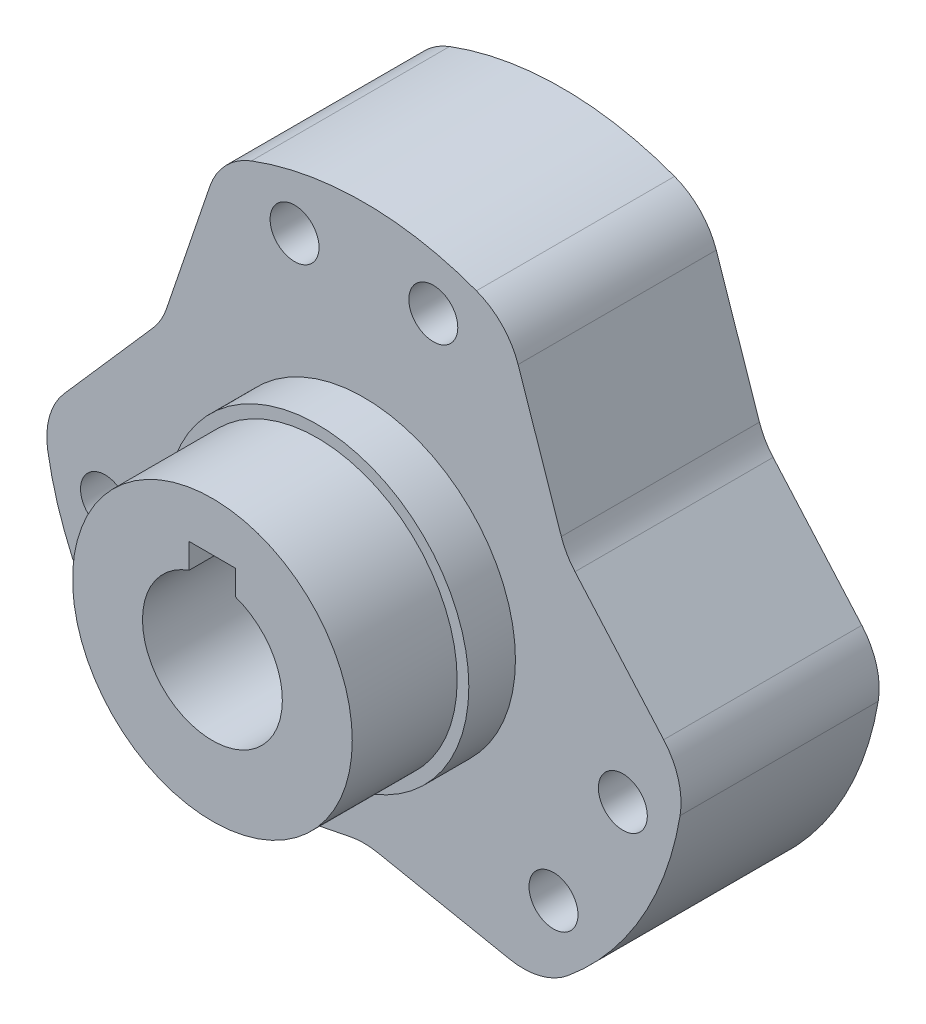
ISO-10303-21;
HEADER;
FILE_DESCRIPTION(('STEP AP214'),'2;1');
FILE_NAME('part.step','',(''),(''),'','','');
FILE_SCHEMA(('AUTOMOTIVE_DESIGN { 1 0 10303 214 1 1 1 1 }'));
ENDSEC;
DATA;
#1=APPLICATION_CONTEXT('core data for automotive mechanical design processes');
#2=APPLICATION_PROTOCOL_DEFINITION('international standard','automotive_design',2000,#1);
#3=PRODUCT_CONTEXT('',#1,'mechanical');
#4=PRODUCT('Part','Part','',(#3));
#5=PRODUCT_RELATED_PRODUCT_CATEGORY('part','',(#4));
#6=PRODUCT_DEFINITION_FORMATION('','',#4);
#7=PRODUCT_DEFINITION_CONTEXT('part definition',#1,'design');
#8=PRODUCT_DEFINITION('design','',#6,#7);
#9=PRODUCT_DEFINITION_SHAPE('','',#8);
#10=(LENGTH_UNIT() NAMED_UNIT(*) SI_UNIT(.MILLI.,.METRE.));
#11=(NAMED_UNIT(*) PLANE_ANGLE_UNIT() SI_UNIT($,.RADIAN.));
#12=(NAMED_UNIT(*) SI_UNIT($,.STERADIAN.) SOLID_ANGLE_UNIT());
#13=UNCERTAINTY_MEASURE_WITH_UNIT(LENGTH_MEASURE(1.E-05),#10,'distance_accuracy_value','');
#14=(GEOMETRIC_REPRESENTATION_CONTEXT(3) GLOBAL_UNCERTAINTY_ASSIGNED_CONTEXT((#13)) GLOBAL_UNIT_ASSIGNED_CONTEXT((#10,
#11,#12)) REPRESENTATION_CONTEXT('',''));
#15=CARTESIAN_POINT('',(0.,0.,0.));
#16=DIRECTION('',(0.,0.,1.));
#17=DIRECTION('',(1.,0.,0.));
#18=AXIS2_PLACEMENT_3D('',#15,#16,#17);
#19=CARTESIAN_POINT('',(0.,0.,-4.));
#20=DIRECTION('',(0.,0.,-1.));
#21=DIRECTION('',(-1.,0.,0.));
#22=AXIS2_PLACEMENT_3D('',#19,#20,#21);
#23=PLANE('',#22);
#24=CARTESIAN_POINT('',(0.,0.,-4.));
#25=DIRECTION('',(0.,0.,-1.));
#26=DIRECTION('',(-1.,0.,0.));
#27=AXIS2_PLACEMENT_3D('',#24,#25,#26);
#28=CIRCLE('',#27,13.);
#29=CARTESIAN_POINT('',(-13.,0.,-4.));
#30=VERTEX_POINT('',#29);
#31=EDGE_CURVE('E291',#30,#30,#28,.T.);
#32=ORIENTED_EDGE('',*,*,#31,.T.);
#33=EDGE_LOOP('',(#32));
#34=FACE_BOUND('',#33,.T.);
#35=CARTESIAN_POINT('',(0.,0.,-4.));
#36=DIRECTION('',(0.,0.,-1.));
#37=DIRECTION('',(-1.,0.,0.));
#38=AXIS2_PLACEMENT_3D('',#35,#36,#37);
#39=CIRCLE('',#38,6.);
#40=CARTESIAN_POINT('',(-2.,5.65685424949238,-4.));
#41=VERTEX_POINT('',#40);
#42=CARTESIAN_POINT('',(2.,5.65685424949238,-4.));
#43=VERTEX_POINT('',#42);
#44=EDGE_CURVE('E204',#41,#43,#39,.F.);
#45=ORIENTED_EDGE('',*,*,#44,.T.);
#46=DIRECTION('',(0.,-1.,0.));
#47=VECTOR('',#46,1.);
#48=CARTESIAN_POINT('',(2.,7.8,-4.));
#49=LINE('',#48,#47);
#50=CARTESIAN_POINT('',(2.,7.8,-4.));
#51=VERTEX_POINT('',#50);
#52=EDGE_CURVE('E188',#51,#43,#49,.T.);
#53=ORIENTED_EDGE('',*,*,#52,.F.);
#54=DIRECTION('',(1.,0.,0.));
#55=VECTOR('',#54,1.);
#56=CARTESIAN_POINT('',(-2.,7.8,-4.));
#57=LINE('',#56,#55);
#58=CARTESIAN_POINT('',(-2.,7.8,-4.));
#59=VERTEX_POINT('',#58);
#60=EDGE_CURVE('E198',#59,#51,#57,.T.);
#61=ORIENTED_EDGE('',*,*,#60,.F.);
#62=DIRECTION('',(0.,1.,0.));
#63=VECTOR('',#62,1.);
#64=CARTESIAN_POINT('',(-2.,5.65685424949238,-4.));
#65=LINE('',#64,#63);
#66=EDGE_CURVE('E209',#41,#59,#65,.T.);
#67=ORIENTED_EDGE('',*,*,#66,.F.);
#68=EDGE_LOOP('',(#45,#53,#61,#67));
#69=FACE_BOUND('',#68,.T.);
#70=ADVANCED_FACE('F38',(#34,#69),#23,.T.);
#71=CARTESIAN_POINT('',(0.,0.,30.));
#72=DIRECTION('',(0.,0.,1.));
#73=DIRECTION('',(1.,0.,0.));
#74=AXIS2_PLACEMENT_3D('',#71,#72,#73);
#75=PLANE('',#74);
#76=CARTESIAN_POINT('',(0.,0.,30.));
#77=DIRECTION('',(0.,0.,1.));
#78=DIRECTION('',(1.,0.,0.));
#79=AXIS2_PLACEMENT_3D('',#76,#77,#78);
#80=CIRCLE('',#79,12.);
#81=CARTESIAN_POINT('',(12.,0.,30.));
#82=VERTEX_POINT('',#81);
#83=EDGE_CURVE('E213',#82,#82,#80,.T.);
#84=ORIENTED_EDGE('',*,*,#83,.T.);
#85=EDGE_LOOP('',(#84));
#86=FACE_BOUND('',#85,.T.);
#87=DIRECTION('',(1.,0.,0.));
#88=VECTOR('',#87,1.);
#89=CARTESIAN_POINT('',(-2.,7.8,30.));
#90=LINE('',#89,#88);
#91=CARTESIAN_POINT('',(-2.,7.8,30.));
#92=VERTEX_POINT('',#91);
#93=CARTESIAN_POINT('',(2.,7.8,30.));
#94=VERTEX_POINT('',#93);
#95=EDGE_CURVE('E778',#92,#94,#90,.T.);
#96=ORIENTED_EDGE('',*,*,#95,.T.);
#97=DIRECTION('',(0.,-1.,0.));
#98=VECTOR('',#97,1.);
#99=CARTESIAN_POINT('',(2.,7.8,30.));
#100=LINE('',#99,#98);
#101=CARTESIAN_POINT('',(2.,5.65685424949238,30.));
#102=VERTEX_POINT('',#101);
#103=EDGE_CURVE('E779',#94,#102,#100,.T.);
#104=ORIENTED_EDGE('',*,*,#103,.T.);
#105=CARTESIAN_POINT('',(0.,0.,30.));
#106=DIRECTION('',(0.,0.,1.));
#107=DIRECTION('',(1.,0.,0.));
#108=AXIS2_PLACEMENT_3D('',#105,#106,#107);
#109=CIRCLE('',#108,6.);
#110=CARTESIAN_POINT('',(-2.,5.65685424949238,30.));
#111=VERTEX_POINT('',#110);
#112=EDGE_CURVE('E206',#111,#102,#109,.T.);
#113=ORIENTED_EDGE('',*,*,#112,.F.);
#114=DIRECTION('',(0.,1.,0.));
#115=VECTOR('',#114,1.);
#116=CARTESIAN_POINT('',(-2.,5.65685424949238,30.));
#117=LINE('',#116,#115);
#118=EDGE_CURVE('E53',#111,#92,#117,.T.);
#119=ORIENTED_EDGE('',*,*,#118,.T.);
#120=EDGE_LOOP('',(#96,#104,#113,#119));
#121=FACE_BOUND('',#120,.T.);
#122=ADVANCED_FACE('F480',(#86,#121),#75,.T.);
#123=CARTESIAN_POINT('',(0.,0.,-20.9705627484771));
#124=DIRECTION('',(0.,0.,1.));
#125=DIRECTION('',(1.,0.,0.));
#126=AXIS2_PLACEMENT_3D('',#123,#124,#125);
#127=CYLINDRICAL_SURFACE('',#126,6.);
#128=DIRECTION('',(0.,0.,1.));
#129=VECTOR('',#128,1.);
#130=CARTESIAN_POINT('',(2.,5.65685424949238,-8.53795920077725));
#131=LINE('',#130,#129);
#132=EDGE_CURVE('E192',#43,#102,#131,.T.);
#133=ORIENTED_EDGE('',*,*,#132,.F.);
#134=ORIENTED_EDGE('',*,*,#44,.F.);
#135=DIRECTION('',(0.,0.,1.));
#136=VECTOR('',#135,1.);
#137=CARTESIAN_POINT('',(-2.,5.65685424949238,-8.53795920077725));
#138=LINE('',#137,#136);
#139=EDGE_CURVE('E775',#41,#111,#138,.T.);
#140=ORIENTED_EDGE('',*,*,#139,.T.);
#141=ORIENTED_EDGE('',*,*,#112,.T.);
#142=EDGE_LOOP('',(#133,#134,#140,#141));
#143=FACE_BOUND('',#142,.T.);
#144=ADVANCED_FACE('F203',(#143),#127,.F.);
#145=CARTESIAN_POINT('',(0.,0.,21.));
#146=DIRECTION('',(0.,0.,1.));
#147=DIRECTION('',(1.,0.,0.));
#148=AXIS2_PLACEMENT_3D('',#145,#146,#147);
#149=PLANE('',#148);
#150=CARTESIAN_POINT('',(0.,0.,21.));
#151=DIRECTION('',(0.,0.,1.));
#152=DIRECTION('',(1.,0.,0.));
#153=AXIS2_PLACEMENT_3D('',#150,#151,#152);
#154=CIRCLE('',#153,13.);
#155=CARTESIAN_POINT('',(13.,0.,21.));
#156=VERTEX_POINT('',#155);
#157=EDGE_CURVE('E288',#156,#156,#154,.T.);
#158=ORIENTED_EDGE('',*,*,#157,.T.);
#159=EDGE_LOOP('',(#158));
#160=FACE_BOUND('',#159,.T.);
#161=CARTESIAN_POINT('',(0.,0.,21.));
#162=DIRECTION('',(0.,0.,1.));
#163=DIRECTION('',(1.,0.,0.));
#164=AXIS2_PLACEMENT_3D('',#161,#162,#163);
#165=CIRCLE('',#164,12.);
#166=CARTESIAN_POINT('',(12.,0.,21.));
#167=VERTEX_POINT('',#166);
#168=EDGE_CURVE('E210',#167,#167,#165,.T.);
#169=ORIENTED_EDGE('',*,*,#168,.F.);
#170=EDGE_LOOP('',(#169));
#171=FACE_BOUND('',#170,.T.);
#172=ADVANCED_FACE('F498',(#160,#171),#149,.T.);
#173=CARTESIAN_POINT('',(0.,0.,17.));
#174=DIRECTION('',(0.,0.,1.));
#175=DIRECTION('',(1.,0.,0.));
#176=AXIS2_PLACEMENT_3D('',#173,#174,#175);
#177=PLANE('',#176);
#178=CARTESIAN_POINT('',(-22.2162940046485,-5.95283803735839,17.));
#179=DIRECTION('',(0.,0.,1.));
#180=DIRECTION('',(1.,0.,0.));
#181=AXIS2_PLACEMENT_3D('',#178,#179,#180);
#182=CIRCLE('',#181,2.1);
#183=CARTESIAN_POINT('',(-20.1162940046485,-5.95283803735839,17.));
#184=VERTEX_POINT('',#183);
#185=EDGE_CURVE('E219',#184,#184,#182,.T.);
#186=ORIENTED_EDGE('',*,*,#185,.F.);
#187=EDGE_LOOP('',(#186));
#188=FACE_BOUND('',#187,.T.);
#189=CARTESIAN_POINT('',(-16.2634559672903,-16.2634559672909,17.));
#190=DIRECTION('',(0.,0.,1.));
#191=DIRECTION('',(1.,0.,0.));
#192=AXIS2_PLACEMENT_3D('',#189,#190,#191);
#193=CIRCLE('',#192,2.1);
#194=CARTESIAN_POINT('',(-14.1634559672903,-16.2634559672909,17.));
#195=VERTEX_POINT('',#194);
#196=EDGE_CURVE('E226',#195,#195,#193,.T.);
#197=ORIENTED_EDGE('',*,*,#196,.F.);
#198=EDGE_LOOP('',(#197));
#199=FACE_BOUND('',#198,.T.);
#200=CARTESIAN_POINT('',(5.95283803735767,22.2162940046487,17.));
#201=DIRECTION('',(0.,0.,1.));
#202=DIRECTION('',(1.,0.,0.));
#203=AXIS2_PLACEMENT_3D('',#200,#201,#202);
#204=CIRCLE('',#203,2.1);
#205=CARTESIAN_POINT('',(8.05283803735766,22.2162940046487,17.));
#206=VERTEX_POINT('',#205);
#207=EDGE_CURVE('E232',#206,#206,#204,.T.);
#208=ORIENTED_EDGE('',*,*,#207,.F.);
#209=EDGE_LOOP('',(#208));
#210=FACE_BOUND('',#209,.T.);
#211=CARTESIAN_POINT('',(-5.95283803735832,22.2162940046485,17.));
#212=DIRECTION('',(0.,0.,1.));
#213=DIRECTION('',(1.,0.,0.));
#214=AXIS2_PLACEMENT_3D('',#211,#212,#213);
#215=CIRCLE('',#214,2.1);
#216=CARTESIAN_POINT('',(-3.85283803735832,22.2162940046485,17.));
#217=VERTEX_POINT('',#216);
#218=EDGE_CURVE('E238',#217,#217,#215,.T.);
#219=ORIENTED_EDGE('',*,*,#218,.F.);
#220=EDGE_LOOP('',(#219));
#221=FACE_BOUND('',#220,.T.);
#222=CARTESIAN_POINT('',(16.2634559672907,-16.2634559672904,17.));
#223=DIRECTION('',(0.,0.,1.));
#224=DIRECTION('',(1.,0.,0.));
#225=AXIS2_PLACEMENT_3D('',#222,#223,#224);
#226=CIRCLE('',#225,2.1);
#227=CARTESIAN_POINT('',(18.3634559672907,-16.2634559672904,17.));
#228=VERTEX_POINT('',#227);
#229=EDGE_CURVE('E280',#228,#228,#226,.T.);
#230=ORIENTED_EDGE('',*,*,#229,.F.);
#231=EDGE_LOOP('',(#230));
#232=FACE_BOUND('',#231,.T.);
#233=CARTESIAN_POINT('',(22.2162940046486,-5.95283803735774,17.));
#234=DIRECTION('',(0.,0.,1.));
#235=DIRECTION('',(1.,0.,0.));
#236=AXIS2_PLACEMENT_3D('',#233,#234,#235);
#237=CIRCLE('',#236,2.1);
#238=CARTESIAN_POINT('',(24.3162940046486,-5.95283803735774,17.));
#239=VERTEX_POINT('',#238);
#240=EDGE_CURVE('E284',#239,#239,#237,.T.);
#241=ORIENTED_EDGE('',*,*,#240,.F.);
#242=EDGE_LOOP('',(#241));
#243=FACE_BOUND('',#242,.T.);
#244=CARTESIAN_POINT('',(0.,0.,17.));
#245=DIRECTION('',(0.,0.,1.));
#246=DIRECTION('',(1.,0.,0.));
#247=AXIS2_PLACEMENT_3D('',#244,#245,#246);
#248=CIRCLE('',#247,13.);
#249=CARTESIAN_POINT('',(13.,0.,17.));
#250=VERTEX_POINT('',#249);
#251=EDGE_CURVE('E292',#250,#250,#248,.T.);
#252=ORIENTED_EDGE('',*,*,#251,.F.);
#253=EDGE_LOOP('',(#252));
#254=FACE_BOUND('',#253,.T.);
#255=DIRECTION('',(0.659414568534475,0.751779506773424,0.));
#256=VECTOR('',#255,1.);
#257=CARTESIAN_POINT('',(-14.7464171735444,12.9346467020054,17.));
#258=LINE('',#257,#256);
#259=CARTESIAN_POINT('',(-25.7187324013653,0.425426973259809,17.));
#260=VERTEX_POINT('',#259);
#261=CARTESIAN_POINT('',(-18.1078784990386,9.10234171830709,17.));
#262=VERTEX_POINT('',#261);
#263=EDGE_CURVE('E244',#260,#262,#258,.T.);
#264=ORIENTED_EDGE('',*,*,#263,.F.);
#265=CARTESIAN_POINT('',(-21.2080553607247,-3.53106043794704,17.));
#266=DIRECTION('',(0.,0.,1.));
#267=DIRECTION('',(1.,0.,0.));
#268=AXIS2_PLACEMENT_3D('',#265,#266,#267);
#269=CIRCLE('',#268,6.);
#270=CARTESIAN_POINT('',(-27.1265824381363,-4.51647265318807,17.));
#271=VERTEX_POINT('',#270);
#272=EDGE_CURVE('E389',#260,#271,#269,.T.);
#273=ORIENTED_EDGE('',*,*,#272,.T.);
#274=CARTESIAN_POINT('',(0.,0.,17.));
#275=DIRECTION('',(0.,0.,1.));
#276=DIRECTION('',(1.,0.,0.));
#277=AXIS2_PLACEMENT_3D('',#274,#275,#276);
#278=CIRCLE('',#277,27.5);
#279=CARTESIAN_POINT('',(-17.4746712722265,-21.234073182685,17.));
#280=VERTEX_POINT('',#279);
#281=EDGE_CURVE('E303',#271,#280,#278,.T.);
#282=ORIENTED_EDGE('',*,*,#281,.T.);
#283=CARTESIAN_POINT('',(-13.6620157219225,-16.601184488281,17.));
#284=DIRECTION('',(0.,0.,1.));
#285=DIRECTION('',(1.,0.,0.));
#286=AXIS2_PLACEMENT_3D('',#283,#284,#285);
#287=CIRCLE('',#286,6.);
#288=CARTESIAN_POINT('',(-12.4909356343843,-22.4857890993463,17.));
#289=VERTEX_POINT('',#288);
#290=EDGE_CURVE('E335',#280,#289,#287,.T.);
#291=ORIENTED_EDGE('',*,*,#290,.T.);
#292=DIRECTION('',(0.980767435177556,0.195180014589707,0.));
#293=VECTOR('',#292,1.);
#294=CARTESIAN_POINT('',(3.82852404614129,-19.2380952380952,17.));
#295=LINE('',#294,#293);
#296=CARTESIAN_POINT('',(-1.17108008753822,-20.233053647963,17.));
#297=VERTEX_POINT('',#296);
#298=EDGE_CURVE('E271',#289,#297,#295,.T.);
#299=ORIENTED_EDGE('',*,*,#298,.T.);
#300=CARTESIAN_POINT('',(0.,-26.1176582590283,17.));
#301=DIRECTION('',(0.,0.,1.));
#302=DIRECTION('',(1.,0.,0.));
#303=AXIS2_PLACEMENT_3D('',#300,#301,#302);
#304=CIRCLE('',#303,6.);
#305=CARTESIAN_POINT('',(1.17108008753826,-20.233053647963,17.));
#306=VERTEX_POINT('',#305);
#307=EDGE_CURVE('E339',#297,#306,#304,.F.);
#308=ORIENTED_EDGE('',*,*,#307,.T.);
#309=DIRECTION('',(-0.980767435177556,0.195180014589707,0.));
#310=VECTOR('',#309,1.);
#311=CARTESIAN_POINT('',(-3.82852404614129,-19.2380952380952,17.));
#312=LINE('',#311,#310);
#313=CARTESIAN_POINT('',(12.4909356343843,-22.4857890993463,17.));
#314=VERTEX_POINT('',#313);
#315=EDGE_CURVE('E268',#314,#306,#312,.T.);
#316=ORIENTED_EDGE('',*,*,#315,.F.);
#317=CARTESIAN_POINT('',(13.6620157219226,-16.601184488281,17.));
#318=DIRECTION('',(0.,0.,1.));
#319=DIRECTION('',(1.,0.,0.));
#320=AXIS2_PLACEMENT_3D('',#317,#318,#319);
#321=CIRCLE('',#320,6.);
#322=CARTESIAN_POINT('',(17.4746712722265,-21.234073182685,17.));
#323=VERTEX_POINT('',#322);
#324=EDGE_CURVE('E337',#314,#323,#321,.T.);
#325=ORIENTED_EDGE('',*,*,#324,.T.);
#326=CARTESIAN_POINT('',(27.1265824381364,-4.51647265318768,17.));
#327=VERTEX_POINT('',#326);
#328=EDGE_CURVE('E298',#323,#327,#278,.T.);
#329=ORIENTED_EDGE('',*,*,#328,.T.);
#330=CARTESIAN_POINT('',(21.2080553607248,-3.53106043794673,17.));
#331=DIRECTION('',(0.,0.,1.));
#332=DIRECTION('',(1.,0.,0.));
#333=AXIS2_PLACEMENT_3D('',#330,#331,#332);
#334=CIRCLE('',#333,6.);
#335=CARTESIAN_POINT('',(25.7187324013653,0.42542697326017,17.));
#336=VERTEX_POINT('',#335);
#337=EDGE_CURVE('E355',#327,#336,#334,.T.);
#338=ORIENTED_EDGE('',*,*,#337,.T.);
#339=DIRECTION('',(-0.659414568534485,0.751779506773415,0.));
#340=VECTOR('',#339,1.);
#341=CARTESIAN_POINT('',(14.7464171735442,12.9346467020056,17.));
#342=LINE('',#341,#340);
#343=CARTESIAN_POINT('',(18.1078784990384,9.10234171830737,17.));
#344=VERTEX_POINT('',#343);
#345=EDGE_CURVE('E259',#336,#344,#342,.T.);
#346=ORIENTED_EDGE('',*,*,#345,.T.);
#347=CARTESIAN_POINT('',(22.6185555396789,13.0588291295143,17.));
#348=DIRECTION('',(0.,0.,1.));
#349=DIRECTION('',(1.,0.,0.));
#350=AXIS2_PLACEMENT_3D('',#347,#348,#349);
#351=CIRCLE('',#350,6.);
#352=CARTESIAN_POINT('',(16.9367984115002,11.1307119296558,17.));
#353=VERTEX_POINT('',#352);
#354=EDGE_CURVE('E366',#344,#353,#351,.F.);
#355=ORIENTED_EDGE('',*,*,#354,.T.);
#356=DIRECTION('',(0.321352866643079,-0.946959521363124,0.));
#357=VECTOR('',#356,1.);
#358=CARTESIAN_POINT('',(18.5749412196855,6.30344853608976,17.));
#359=LINE('',#358,#357);
#360=CARTESIAN_POINT('',(13.2277967669809,22.0603621260863,17.));
#361=VERTEX_POINT('',#360);
#362=EDGE_CURVE('E256',#361,#353,#359,.T.);
#363=ORIENTED_EDGE('',*,*,#362,.F.);
#364=CARTESIAN_POINT('',(7.54603963880213,20.1322449262278,17.));
#365=DIRECTION('',(0.,0.,1.));
#366=DIRECTION('',(1.,0.,0.));
#367=AXIS2_PLACEMENT_3D('',#364,#365,#366);
#368=CIRCLE('',#367,6.);
#369=CARTESIAN_POINT('',(9.6519111659097,25.7505458358728,17.));
#370=VERTEX_POINT('',#369);
#371=EDGE_CURVE('E357',#361,#370,#368,.T.);
#372=ORIENTED_EDGE('',*,*,#371,.T.);
#373=CARTESIAN_POINT('',(-9.65191116591006,25.7505458358727,17.));
#374=VERTEX_POINT('',#373);
#375=EDGE_CURVE('E302',#370,#374,#278,.T.);
#376=ORIENTED_EDGE('',*,*,#375,.T.);
#377=CARTESIAN_POINT('',(-7.54603963880241,20.1322449262277,17.));
#378=DIRECTION('',(0.,0.,1.));
#379=DIRECTION('',(1.,0.,0.));
#380=AXIS2_PLACEMENT_3D('',#377,#378,#379);
#381=CIRCLE('',#380,6.);
#382=CARTESIAN_POINT('',(-13.2277967669812,22.0603621260861,17.));
#383=VERTEX_POINT('',#382);
#384=EDGE_CURVE('E387',#374,#383,#381,.T.);
#385=ORIENTED_EDGE('',*,*,#384,.T.);
#386=DIRECTION('',(-0.321352866643066,-0.946959521363128,0.));
#387=VECTOR('',#386,1.);
#388=CARTESIAN_POINT('',(-18.5749412196856,6.3034485360895,17.));
#389=LINE('',#388,#387);
#390=CARTESIAN_POINT('',(-16.9367984115003,11.1307119296555,17.));
#391=VERTEX_POINT('',#390);
#392=EDGE_CURVE('E247',#383,#391,#389,.T.);
#393=ORIENTED_EDGE('',*,*,#392,.T.);
#394=CARTESIAN_POINT('',(-22.6185555396791,13.0588291295139,17.));
#395=DIRECTION('',(0.,0.,1.));
#396=DIRECTION('',(1.,0.,0.));
#397=AXIS2_PLACEMENT_3D('',#394,#395,#396);
#398=CIRCLE('',#397,6.);
#399=EDGE_CURVE('E46',#391,#262,#398,.F.);
#400=ORIENTED_EDGE('',*,*,#399,.T.);
#401=EDGE_LOOP('',(#264,#273,#282,#291,#299,#308,#316,#325,#329,#338,#346,#355,#363,#372,#376,
#385,#393,#400));
#402=FACE_BOUND('',#401,.T.);
#403=ADVANCED_FACE('F393',(#188,#199,#210,#221,#232,#243,#254,#402),#177,.T.);
#404=CARTESIAN_POINT('',(0.,0.,0.));
#405=DIRECTION('',(0.,0.,1.));
#406=DIRECTION('',(1.,0.,0.));
#407=AXIS2_PLACEMENT_3D('',#404,#405,#406);
#408=PLANE('',#407);
#409=CARTESIAN_POINT('',(-22.2162940046485,-5.95283803735839,0.));
#410=DIRECTION('',(0.,0.,1.));
#411=DIRECTION('',(1.,0.,0.));
#412=AXIS2_PLACEMENT_3D('',#409,#410,#411);
#413=CIRCLE('',#412,2.1);
#414=CARTESIAN_POINT('',(-20.1162940046485,-5.95283803735839,0.));
#415=VERTEX_POINT('',#414);
#416=EDGE_CURVE('E223',#415,#415,#413,.T.);
#417=ORIENTED_EDGE('',*,*,#416,.T.);
#418=EDGE_LOOP('',(#417));
#419=FACE_BOUND('',#418,.T.);
#420=CARTESIAN_POINT('',(-16.2634559672903,-16.2634559672909,0.));
#421=DIRECTION('',(0.,0.,1.));
#422=DIRECTION('',(1.,0.,0.));
#423=AXIS2_PLACEMENT_3D('',#420,#421,#422);
#424=CIRCLE('',#423,2.1);
#425=CARTESIAN_POINT('',(-14.1634559672903,-16.2634559672909,0.));
#426=VERTEX_POINT('',#425);
#427=EDGE_CURVE('E229',#426,#426,#424,.T.);
#428=ORIENTED_EDGE('',*,*,#427,.T.);
#429=EDGE_LOOP('',(#428));
#430=FACE_BOUND('',#429,.T.);
#431=CARTESIAN_POINT('',(5.95283803735767,22.2162940046487,0.));
#432=DIRECTION('',(0.,0.,1.));
#433=DIRECTION('',(1.,0.,0.));
#434=AXIS2_PLACEMENT_3D('',#431,#432,#433);
#435=CIRCLE('',#434,2.1);
#436=CARTESIAN_POINT('',(8.05283803735766,22.2162940046487,0.));
#437=VERTEX_POINT('',#436);
#438=EDGE_CURVE('E235',#437,#437,#435,.T.);
#439=ORIENTED_EDGE('',*,*,#438,.T.);
#440=EDGE_LOOP('',(#439));
#441=FACE_BOUND('',#440,.T.);
#442=CARTESIAN_POINT('',(-5.95283803735832,22.2162940046485,0.));
#443=DIRECTION('',(0.,0.,1.));
#444=DIRECTION('',(1.,0.,0.));
#445=AXIS2_PLACEMENT_3D('',#442,#443,#444);
#446=CIRCLE('',#445,2.1);
#447=CARTESIAN_POINT('',(-3.85283803735832,22.2162940046485,0.));
#448=VERTEX_POINT('',#447);
#449=EDGE_CURVE('E241',#448,#448,#446,.T.);
#450=ORIENTED_EDGE('',*,*,#449,.T.);
#451=EDGE_LOOP('',(#450));
#452=FACE_BOUND('',#451,.T.);
#453=CARTESIAN_POINT('',(16.2634559672907,-16.2634559672904,0.));
#454=DIRECTION('',(0.,0.,1.));
#455=DIRECTION('',(1.,0.,0.));
#456=AXIS2_PLACEMENT_3D('',#453,#454,#455);
#457=CIRCLE('',#456,2.1);
#458=CARTESIAN_POINT('',(18.3634559672907,-16.2634559672904,0.));
#459=VERTEX_POINT('',#458);
#460=EDGE_CURVE('E283',#459,#459,#457,.T.);
#461=ORIENTED_EDGE('',*,*,#460,.T.);
#462=EDGE_LOOP('',(#461));
#463=FACE_BOUND('',#462,.T.);
#464=CARTESIAN_POINT('',(22.2162940046486,-5.95283803735774,0.));
#465=DIRECTION('',(0.,0.,1.));
#466=DIRECTION('',(1.,0.,0.));
#467=AXIS2_PLACEMENT_3D('',#464,#465,#466);
#468=CIRCLE('',#467,2.1);
#469=CARTESIAN_POINT('',(24.3162940046486,-5.95283803735774,0.));
#470=VERTEX_POINT('',#469);
#471=EDGE_CURVE('E287',#470,#470,#468,.T.);
#472=ORIENTED_EDGE('',*,*,#471,.T.);
#473=EDGE_LOOP('',(#472));
#474=FACE_BOUND('',#473,.T.);
#475=CARTESIAN_POINT('',(0.,0.,0.));
#476=DIRECTION('',(0.,0.,1.));
#477=DIRECTION('',(1.,0.,0.));
#478=AXIS2_PLACEMENT_3D('',#475,#476,#477);
#479=CIRCLE('',#478,13.);
#480=CARTESIAN_POINT('',(13.,0.,0.));
#481=VERTEX_POINT('',#480);
#482=EDGE_CURVE('E301',#481,#481,#479,.F.);
#483=ORIENTED_EDGE('',*,*,#482,.F.);
#484=EDGE_LOOP('',(#483));
#485=FACE_BOUND('',#484,.T.);
#486=CARTESIAN_POINT('',(0.,0.,0.));
#487=DIRECTION('',(0.,0.,1.));
#488=DIRECTION('',(1.,0.,0.));
#489=AXIS2_PLACEMENT_3D('',#486,#487,#488);
#490=CIRCLE('',#489,27.5);
#491=CARTESIAN_POINT('',(-27.1265824381363,-4.51647265318807,0.));
#492=VERTEX_POINT('',#491);
#493=CARTESIAN_POINT('',(-17.4746712722265,-21.234073182685,0.));
#494=VERTEX_POINT('',#493);
#495=EDGE_CURVE('E297',#492,#494,#490,.T.);
#496=ORIENTED_EDGE('',*,*,#495,.F.);
#497=CARTESIAN_POINT('',(-21.2080553607247,-3.53106043794704,0.));
#498=DIRECTION('',(0.,0.,1.));
#499=DIRECTION('',(1.,0.,0.));
#500=AXIS2_PLACEMENT_3D('',#497,#498,#499);
#501=CIRCLE('',#500,6.);
#502=CARTESIAN_POINT('',(-25.7187324013653,0.425426973259806,0.));
#503=VERTEX_POINT('',#502);
#504=EDGE_CURVE('E385',#492,#503,#501,.F.);
#505=ORIENTED_EDGE('',*,*,#504,.T.);
#506=DIRECTION('',(0.659414568534475,0.751779506773424,0.));
#507=VECTOR('',#506,1.);
#508=CARTESIAN_POINT('',(-14.7464171735444,12.9346467020054,0.));
#509=LINE('',#508,#507);
#510=CARTESIAN_POINT('',(-18.1078784990386,9.10234171830709,0.));
#511=VERTEX_POINT('',#510);
#512=EDGE_CURVE('E250',#503,#511,#509,.T.);
#513=ORIENTED_EDGE('',*,*,#512,.T.);
#514=CARTESIAN_POINT('',(-22.6185555396791,13.0588291295139,0.));
#515=DIRECTION('',(0.,0.,1.));
#516=DIRECTION('',(1.,0.,0.));
#517=AXIS2_PLACEMENT_3D('',#514,#515,#516);
#518=CIRCLE('',#517,6.);
#519=CARTESIAN_POINT('',(-16.9367984115003,11.1307119296555,0.));
#520=VERTEX_POINT('',#519);
#521=EDGE_CURVE('E11',#511,#520,#518,.T.);
#522=ORIENTED_EDGE('',*,*,#521,.T.);
#523=DIRECTION('',(-0.321352866643066,-0.946959521363128,0.));
#524=VECTOR('',#523,1.);
#525=CARTESIAN_POINT('',(-18.5749412196856,6.3034485360895,0.));
#526=LINE('',#525,#524);
#527=CARTESIAN_POINT('',(-13.2277967669812,22.0603621260861,0.));
#528=VERTEX_POINT('',#527);
#529=EDGE_CURVE('E253',#528,#520,#526,.T.);
#530=ORIENTED_EDGE('',*,*,#529,.F.);
#531=CARTESIAN_POINT('',(-7.54603963880241,20.1322449262277,0.));
#532=DIRECTION('',(0.,0.,1.));
#533=DIRECTION('',(1.,0.,0.));
#534=AXIS2_PLACEMENT_3D('',#531,#532,#533);
#535=CIRCLE('',#534,6.);
#536=CARTESIAN_POINT('',(-9.65191116591006,25.7505458358727,0.));
#537=VERTEX_POINT('',#536);
#538=EDGE_CURVE('E383',#528,#537,#535,.F.);
#539=ORIENTED_EDGE('',*,*,#538,.T.);
#540=CARTESIAN_POINT('',(9.6519111659097,25.7505458358728,0.));
#541=VERTEX_POINT('',#540);
#542=EDGE_CURVE('E307',#541,#537,#490,.T.);
#543=ORIENTED_EDGE('',*,*,#542,.F.);
#544=CARTESIAN_POINT('',(7.54603963880213,20.1322449262278,0.));
#545=DIRECTION('',(0.,0.,1.));
#546=DIRECTION('',(1.,0.,0.));
#547=AXIS2_PLACEMENT_3D('',#544,#545,#546);
#548=CIRCLE('',#547,6.);
#549=CARTESIAN_POINT('',(13.2277967669809,22.0603621260863,0.));
#550=VERTEX_POINT('',#549);
#551=EDGE_CURVE('E353',#541,#550,#548,.F.);
#552=ORIENTED_EDGE('',*,*,#551,.T.);
#553=DIRECTION('',(0.321352866643079,-0.946959521363123,0.));
#554=VECTOR('',#553,1.);
#555=CARTESIAN_POINT('',(18.5749412196855,6.30344853608976,0.));
#556=LINE('',#555,#554);
#557=CARTESIAN_POINT('',(16.9367984115002,11.1307119296558,0.));
#558=VERTEX_POINT('',#557);
#559=EDGE_CURVE('E262',#550,#558,#556,.T.);
#560=ORIENTED_EDGE('',*,*,#559,.T.);
#561=CARTESIAN_POINT('',(22.6185555396789,13.0588291295143,0.));
#562=DIRECTION('',(0.,0.,1.));
#563=DIRECTION('',(1.,0.,0.));
#564=AXIS2_PLACEMENT_3D('',#561,#562,#563);
#565=CIRCLE('',#564,6.);
#566=CARTESIAN_POINT('',(18.1078784990384,9.10234171830737,0.));
#567=VERTEX_POINT('',#566);
#568=EDGE_CURVE('E368',#558,#567,#565,.T.);
#569=ORIENTED_EDGE('',*,*,#568,.T.);
#570=DIRECTION('',(-0.659414568534485,0.751779506773415,0.));
#571=VECTOR('',#570,1.);
#572=CARTESIAN_POINT('',(14.7464171735442,12.9346467020056,0.));
#573=LINE('',#572,#571);
#574=CARTESIAN_POINT('',(25.7187324013653,0.425426973260177,0.));
#575=VERTEX_POINT('',#574);
#576=EDGE_CURVE('E265',#575,#567,#573,.T.);
#577=ORIENTED_EDGE('',*,*,#576,.F.);
#578=CARTESIAN_POINT('',(21.2080553607248,-3.53106043794673,0.));
#579=DIRECTION('',(0.,0.,1.));
#580=DIRECTION('',(1.,0.,0.));
#581=AXIS2_PLACEMENT_3D('',#578,#579,#580);
#582=CIRCLE('',#581,6.);
#583=CARTESIAN_POINT('',(27.1265824381364,-4.51647265318768,0.));
#584=VERTEX_POINT('',#583);
#585=EDGE_CURVE('E351',#575,#584,#582,.F.);
#586=ORIENTED_EDGE('',*,*,#585,.T.);
#587=CARTESIAN_POINT('',(17.4746712722265,-21.234073182685,0.));
#588=VERTEX_POINT('',#587);
#589=EDGE_CURVE('E304',#588,#584,#490,.T.);
#590=ORIENTED_EDGE('',*,*,#589,.F.);
#591=CARTESIAN_POINT('',(13.6620157219226,-16.601184488281,0.));
#592=DIRECTION('',(0.,0.,1.));
#593=DIRECTION('',(1.,0.,0.));
#594=AXIS2_PLACEMENT_3D('',#591,#592,#593);
#595=CIRCLE('',#594,6.);
#596=CARTESIAN_POINT('',(12.4909356343843,-22.4857890993463,0.));
#597=VERTEX_POINT('',#596);
#598=EDGE_CURVE('E333',#588,#597,#595,.F.);
#599=ORIENTED_EDGE('',*,*,#598,.T.);
#600=DIRECTION('',(-0.980767435177556,0.195180014589707,0.));
#601=VECTOR('',#600,1.);
#602=CARTESIAN_POINT('',(-3.82852404614129,-19.2380952380952,0.));
#603=LINE('',#602,#601);
#604=CARTESIAN_POINT('',(1.17108008753826,-20.233053647963,0.));
#605=VERTEX_POINT('',#604);
#606=EDGE_CURVE('E274',#597,#605,#603,.T.);
#607=ORIENTED_EDGE('',*,*,#606,.T.);
#608=CARTESIAN_POINT('',(0.,-26.1176582590283,0.));
#609=DIRECTION('',(0.,0.,1.));
#610=DIRECTION('',(1.,0.,0.));
#611=AXIS2_PLACEMENT_3D('',#608,#609,#610);
#612=CIRCLE('',#611,6.);
#613=CARTESIAN_POINT('',(-1.17108008753822,-20.233053647963,0.));
#614=VERTEX_POINT('',#613);
#615=EDGE_CURVE('E341',#605,#614,#612,.T.);
#616=ORIENTED_EDGE('',*,*,#615,.T.);
#617=DIRECTION('',(0.980767435177556,0.195180014589707,0.));
#618=VECTOR('',#617,1.);
#619=CARTESIAN_POINT('',(3.82852404614129,-19.2380952380952,0.));
#620=LINE('',#619,#618);
#621=CARTESIAN_POINT('',(-12.4909356343843,-22.4857890993463,0.));
#622=VERTEX_POINT('',#621);
#623=EDGE_CURVE('E277',#622,#614,#620,.T.);
#624=ORIENTED_EDGE('',*,*,#623,.F.);
#625=CARTESIAN_POINT('',(-13.6620157219225,-16.601184488281,0.));
#626=DIRECTION('',(0.,0.,1.));
#627=DIRECTION('',(1.,0.,0.));
#628=AXIS2_PLACEMENT_3D('',#625,#626,#627);
#629=CIRCLE('',#628,6.);
#630=EDGE_CURVE('E330',#622,#494,#629,.F.);
#631=ORIENTED_EDGE('',*,*,#630,.T.);
#632=EDGE_LOOP('',(#496,#505,#513,#522,#530,#539,#543,#552,#560,#569,#577,#586,#590,#599,#607,
#616,#624,#631));
#633=FACE_BOUND('',#632,.T.);
#634=ADVANCED_FACE('F408',(#419,#430,#441,#452,#463,#474,#485,#633),#408,.F.);
#635=CARTESIAN_POINT('',(0.,0.,17.));
#636=DIRECTION('',(0.,0.,-1.));
#637=DIRECTION('',(-1.,0.,0.));
#638=AXIS2_PLACEMENT_3D('',#635,#636,#637);
#639=CYLINDRICAL_SURFACE('',#638,27.5);
#640=ORIENTED_EDGE('',*,*,#542,.T.);
#641=DIRECTION('',(0.,0.,-1.));
#642=VECTOR('',#641,1.);
#643=CARTESIAN_POINT('',(-9.65191116591006,25.7505458358727,17.));
#644=LINE('',#643,#642);
#645=EDGE_CURVE('E61',#537,#374,#644,.F.);
#646=ORIENTED_EDGE('',*,*,#645,.T.);
#647=ORIENTED_EDGE('',*,*,#375,.F.);
#648=DIRECTION('',(0.,0.,-1.));
#649=VECTOR('',#648,1.);
#650=CARTESIAN_POINT('',(9.6519111659097,25.7505458358728,17.));
#651=LINE('',#650,#649);
#652=EDGE_CURVE('E348',#370,#541,#651,.T.);
#653=ORIENTED_EDGE('',*,*,#652,.T.);
#654=EDGE_LOOP('',(#640,#646,#647,#653));
#655=FACE_BOUND('',#654,.T.);
#656=ADVANCED_FACE('F415',(#655),#639,.T.);
#657=ORIENTED_EDGE('',*,*,#589,.T.);
#658=DIRECTION('',(0.,0.,-1.));
#659=VECTOR('',#658,1.);
#660=CARTESIAN_POINT('',(27.1265824381364,-4.51647265318768,17.));
#661=LINE('',#660,#659);
#662=EDGE_CURVE('E359',#584,#327,#661,.F.);
#663=ORIENTED_EDGE('',*,*,#662,.T.);
#664=ORIENTED_EDGE('',*,*,#328,.F.);
#665=DIRECTION('',(0.,0.,-1.));
#666=VECTOR('',#665,1.);
#667=CARTESIAN_POINT('',(17.4746712722265,-21.234073182685,17.));
#668=LINE('',#667,#666);
#669=EDGE_CURVE('E327',#323,#588,#668,.T.);
#670=ORIENTED_EDGE('',*,*,#669,.T.);
#671=EDGE_LOOP('',(#657,#663,#664,#670));
#672=FACE_BOUND('',#671,.T.);
#673=ADVANCED_FACE('F447',(#672),#639,.T.);
#674=ORIENTED_EDGE('',*,*,#281,.F.);
#675=DIRECTION('',(0.,0.,-1.));
#676=VECTOR('',#675,1.);
#677=CARTESIAN_POINT('',(-27.1265824381363,-4.51647265318807,17.));
#678=LINE('',#677,#676);
#679=EDGE_CURVE('E380',#271,#492,#678,.T.);
#680=ORIENTED_EDGE('',*,*,#679,.T.);
#681=ORIENTED_EDGE('',*,*,#495,.T.);
#682=DIRECTION('',(0.,0.,-1.));
#683=VECTOR('',#682,1.);
#684=CARTESIAN_POINT('',(-17.4746712722265,-21.234073182685,17.));
#685=LINE('',#684,#683);
#686=EDGE_CURVE('E324',#494,#280,#685,.F.);
#687=ORIENTED_EDGE('',*,*,#686,.T.);
#688=EDGE_LOOP('',(#674,#680,#681,#687));
#689=FACE_BOUND('',#688,.T.);
#690=ADVANCED_FACE('F419',(#689),#639,.T.);
#691=CARTESIAN_POINT('',(0.,0.,-4.));
#692=DIRECTION('',(0.,0.,1.));
#693=DIRECTION('',(1.,0.,0.));
#694=AXIS2_PLACEMENT_3D('',#691,#692,#693);
#695=CYLINDRICAL_SURFACE('',#694,13.);
#696=ORIENTED_EDGE('',*,*,#31,.F.);
#697=EDGE_LOOP('',(#696));
#698=FACE_BOUND('',#697,.T.);
#699=ORIENTED_EDGE('',*,*,#482,.T.);
#700=EDGE_LOOP('',(#699));
#701=FACE_BOUND('',#700,.T.);
#702=ADVANCED_FACE('F492',(#698,#701),#695,.T.);
#703=CARTESIAN_POINT('',(0.,0.,21.));
#704=DIRECTION('',(0.,0.,-1.));
#705=DIRECTION('',(-1.,0.,0.));
#706=AXIS2_PLACEMENT_3D('',#703,#704,#705);
#707=CYLINDRICAL_SURFACE('',#706,13.);
#708=ORIENTED_EDGE('',*,*,#157,.F.);
#709=EDGE_LOOP('',(#708));
#710=FACE_BOUND('',#709,.T.);
#711=ORIENTED_EDGE('',*,*,#251,.T.);
#712=EDGE_LOOP('',(#711));
#713=FACE_BOUND('',#712,.T.);
#714=ADVANCED_FACE('F490',(#710,#713),#707,.T.);
#715=CARTESIAN_POINT('',(22.2162940046486,-5.95283803735774,17.));
#716=DIRECTION('',(0.,0.,1.));
#717=DIRECTION('',(1.,0.,0.));
#718=AXIS2_PLACEMENT_3D('',#715,#716,#717);
#719=CYLINDRICAL_SURFACE('',#718,2.1);
#720=ORIENTED_EDGE('',*,*,#240,.T.);
#721=EDGE_LOOP('',(#720));
#722=FACE_BOUND('',#721,.T.);
#723=ORIENTED_EDGE('',*,*,#471,.F.);
#724=EDGE_LOOP('',(#723));
#725=FACE_BOUND('',#724,.T.);
#726=ADVANCED_FACE('F525',(#722,#725),#719,.F.);
#727=CARTESIAN_POINT('',(16.2634559672907,-16.2634559672904,17.));
#728=DIRECTION('',(0.,0.,1.));
#729=DIRECTION('',(1.,0.,0.));
#730=AXIS2_PLACEMENT_3D('',#727,#728,#729);
#731=CYLINDRICAL_SURFACE('',#730,2.1);
#732=ORIENTED_EDGE('',*,*,#229,.T.);
#733=EDGE_LOOP('',(#732));
#734=FACE_BOUND('',#733,.T.);
#735=ORIENTED_EDGE('',*,*,#460,.F.);
#736=EDGE_LOOP('',(#735));
#737=FACE_BOUND('',#736,.T.);
#738=ADVANCED_FACE('F520',(#734,#737),#731,.F.);
#739=CARTESIAN_POINT('',(3.82852404614129,-19.2380952380952,-4.));
#740=DIRECTION('',(0.195180014589707,-0.980767435177556,0.));
#741=DIRECTION('',(0.980767435177556,0.195180014589707,0.));
#742=AXIS2_PLACEMENT_3D('',#739,#740,#741);
#743=PLANE('',#742);
#744=ORIENTED_EDGE('',*,*,#623,.T.);
#745=DIRECTION('',(0.,0.,1.));
#746=VECTOR('',#745,1.);
#747=CARTESIAN_POINT('',(-1.17108008753822,-20.233053647963,-4.));
#748=LINE('',#747,#746);
#749=EDGE_CURVE('E317',#614,#297,#748,.T.);
#750=ORIENTED_EDGE('',*,*,#749,.T.);
#751=ORIENTED_EDGE('',*,*,#298,.F.);
#752=DIRECTION('',(0.,0.,1.));
#753=VECTOR('',#752,1.);
#754=CARTESIAN_POINT('',(-12.4909356343843,-22.4857890993463,0.));
#755=LINE('',#754,#753);
#756=EDGE_CURVE('E310',#289,#622,#755,.F.);
#757=ORIENTED_EDGE('',*,*,#756,.T.);
#758=EDGE_LOOP('',(#744,#750,#751,#757));
#759=FACE_BOUND('',#758,.T.);
#760=ADVANCED_FACE('F429',(#759),#743,.T.);
#761=CARTESIAN_POINT('',(-3.82852404614129,-19.2380952380952,-4.));
#762=DIRECTION('',(0.195180014589707,0.980767435177556,0.));
#763=DIRECTION('',(-0.980767435177556,0.195180014589707,0.));
#764=AXIS2_PLACEMENT_3D('',#761,#762,#763);
#765=PLANE('',#764);
#766=ORIENTED_EDGE('',*,*,#315,.T.);
#767=DIRECTION('',(0.,0.,1.));
#768=VECTOR('',#767,1.);
#769=CARTESIAN_POINT('',(1.17108008753826,-20.233053647963,-4.));
#770=LINE('',#769,#768);
#771=EDGE_CURVE('E322',#306,#605,#770,.F.);
#772=ORIENTED_EDGE('',*,*,#771,.T.);
#773=ORIENTED_EDGE('',*,*,#606,.F.);
#774=DIRECTION('',(0.,0.,-1.));
#775=VECTOR('',#774,1.);
#776=CARTESIAN_POINT('',(12.4909356343843,-22.4857890993463,-4.));
#777=LINE('',#776,#775);
#778=EDGE_CURVE('E320',#597,#314,#777,.F.);
#779=ORIENTED_EDGE('',*,*,#778,.T.);
#780=EDGE_LOOP('',(#766,#772,#773,#779));
#781=FACE_BOUND('',#780,.T.);
#782=ADVANCED_FACE('F438',(#781),#765,.F.);
#783=CARTESIAN_POINT('',(0.,-26.1176582590283,-4.));
#784=DIRECTION('',(0.,0.,1.));
#785=DIRECTION('',(1.,0.,0.));
#786=AXIS2_PLACEMENT_3D('',#783,#784,#785);
#787=CYLINDRICAL_SURFACE('',#786,6.);
#788=ORIENTED_EDGE('',*,*,#615,.F.);
#789=ORIENTED_EDGE('',*,*,#771,.F.);
#790=ORIENTED_EDGE('',*,*,#307,.F.);
#791=ORIENTED_EDGE('',*,*,#749,.F.);
#792=EDGE_LOOP('',(#788,#789,#790,#791));
#793=FACE_BOUND('',#792,.T.);
#794=ADVANCED_FACE('F433',(#793),#787,.F.);
#795=CARTESIAN_POINT('',(13.6620157219226,-16.601184488281,17.));
#796=DIRECTION('',(0.,0.,-1.));
#797=DIRECTION('',(-1.,0.,0.));
#798=AXIS2_PLACEMENT_3D('',#795,#796,#797);
#799=CYLINDRICAL_SURFACE('',#798,6.);
#800=ORIENTED_EDGE('',*,*,#324,.F.);
#801=ORIENTED_EDGE('',*,*,#778,.F.);
#802=ORIENTED_EDGE('',*,*,#598,.F.);
#803=ORIENTED_EDGE('',*,*,#669,.F.);
#804=EDGE_LOOP('',(#800,#801,#802,#803));
#805=FACE_BOUND('',#804,.T.);
#806=ADVANCED_FACE('F442',(#805),#799,.T.);
#807=CARTESIAN_POINT('',(-13.6620157219225,-16.601184488281,17.));
#808=DIRECTION('',(0.,0.,-1.));
#809=DIRECTION('',(-1.,0.,0.));
#810=AXIS2_PLACEMENT_3D('',#807,#808,#809);
#811=CYLINDRICAL_SURFACE('',#810,6.);
#812=ORIENTED_EDGE('',*,*,#290,.F.);
#813=ORIENTED_EDGE('',*,*,#686,.F.);
#814=ORIENTED_EDGE('',*,*,#630,.F.);
#815=ORIENTED_EDGE('',*,*,#756,.F.);
#816=EDGE_LOOP('',(#812,#813,#814,#815));
#817=FACE_BOUND('',#816,.T.);
#818=ADVANCED_FACE('F426',(#817),#811,.T.);
#819=CARTESIAN_POINT('',(14.7464171735442,12.9346467020056,-4.));
#820=DIRECTION('',(0.751779506773415,0.659414568534485,0.));
#821=DIRECTION('',(-0.659414568534485,0.751779506773415,0.));
#822=AXIS2_PLACEMENT_3D('',#819,#820,#821);
#823=PLANE('',#822);
#824=ORIENTED_EDGE('',*,*,#576,.T.);
#825=DIRECTION('',(0.,0.,1.));
#826=VECTOR('',#825,1.);
#827=CARTESIAN_POINT('',(18.1078784990384,9.10234171830737,-4.));
#828=LINE('',#827,#826);
#829=EDGE_CURVE('E361',#567,#344,#828,.T.);
#830=ORIENTED_EDGE('',*,*,#829,.T.);
#831=ORIENTED_EDGE('',*,*,#345,.F.);
#832=DIRECTION('',(0.,0.,1.));
#833=VECTOR('',#832,1.);
#834=CARTESIAN_POINT('',(25.7187324013653,0.425426973260179,0.));
#835=LINE('',#834,#833);
#836=EDGE_CURVE('E343',#336,#575,#835,.F.);
#837=ORIENTED_EDGE('',*,*,#836,.T.);
#838=EDGE_LOOP('',(#824,#830,#831,#837));
#839=FACE_BOUND('',#838,.T.);
#840=ADVANCED_FACE('F455',(#839),#823,.T.);
#841=CARTESIAN_POINT('',(18.5749412196855,6.30344853608976,-4.));
#842=DIRECTION('',(-0.946959521363123,-0.321352866643079,0.));
#843=DIRECTION('',(0.321352866643079,-0.946959521363123,0.));
#844=AXIS2_PLACEMENT_3D('',#841,#842,#843);
#845=PLANE('',#844);
#846=ORIENTED_EDGE('',*,*,#362,.T.);
#847=DIRECTION('',(0.,0.,1.));
#848=VECTOR('',#847,1.);
#849=CARTESIAN_POINT('',(16.9367984115002,11.1307119296558,-4.));
#850=LINE('',#849,#848);
#851=EDGE_CURVE('E364',#353,#558,#850,.F.);
#852=ORIENTED_EDGE('',*,*,#851,.T.);
#853=ORIENTED_EDGE('',*,*,#559,.F.);
#854=DIRECTION('',(0.,0.,-1.));
#855=VECTOR('',#854,1.);
#856=CARTESIAN_POINT('',(13.2277967669809,22.0603621260863,-4.));
#857=LINE('',#856,#855);
#858=EDGE_CURVE('E346',#550,#361,#857,.F.);
#859=ORIENTED_EDGE('',*,*,#858,.T.);
#860=EDGE_LOOP('',(#846,#852,#853,#859));
#861=FACE_BOUND('',#860,.T.);
#862=ADVANCED_FACE('F465',(#861),#845,.F.);
#863=CARTESIAN_POINT('',(7.54603963880213,20.1322449262278,17.));
#864=DIRECTION('',(0.,0.,-1.));
#865=DIRECTION('',(-1.,0.,0.));
#866=AXIS2_PLACEMENT_3D('',#863,#864,#865);
#867=CYLINDRICAL_SURFACE('',#866,6.);
#868=ORIENTED_EDGE('',*,*,#371,.F.);
#869=ORIENTED_EDGE('',*,*,#858,.F.);
#870=ORIENTED_EDGE('',*,*,#551,.F.);
#871=ORIENTED_EDGE('',*,*,#652,.F.);
#872=EDGE_LOOP('',(#868,#869,#870,#871));
#873=FACE_BOUND('',#872,.T.);
#874=ADVANCED_FACE('F469',(#873),#867,.T.);
#875=CARTESIAN_POINT('',(21.2080553607248,-3.53106043794673,17.));
#876=DIRECTION('',(0.,0.,-1.));
#877=DIRECTION('',(-1.,0.,0.));
#878=AXIS2_PLACEMENT_3D('',#875,#876,#877);
#879=CYLINDRICAL_SURFACE('',#878,6.);
#880=ORIENTED_EDGE('',*,*,#337,.F.);
#881=ORIENTED_EDGE('',*,*,#662,.F.);
#882=ORIENTED_EDGE('',*,*,#585,.F.);
#883=ORIENTED_EDGE('',*,*,#836,.F.);
#884=EDGE_LOOP('',(#880,#881,#882,#883));
#885=FACE_BOUND('',#884,.T.);
#886=ADVANCED_FACE('F451',(#885),#879,.T.);
#887=CARTESIAN_POINT('',(-18.5749412196856,6.3034485360895,-4.));
#888=DIRECTION('',(-0.946959521363128,0.321352866643066,0.));
#889=DIRECTION('',(-0.321352866643066,-0.946959521363128,0.));
#890=AXIS2_PLACEMENT_3D('',#887,#888,#889);
#891=PLANE('',#890);
#892=ORIENTED_EDGE('',*,*,#529,.T.);
#893=DIRECTION('',(0.,0.,1.));
#894=VECTOR('',#893,1.);
#895=CARTESIAN_POINT('',(-16.9367984115003,11.1307119296555,-4.));
#896=LINE('',#895,#894);
#897=EDGE_CURVE('E373',#520,#391,#896,.T.);
#898=ORIENTED_EDGE('',*,*,#897,.T.);
#899=ORIENTED_EDGE('',*,*,#392,.F.);
#900=DIRECTION('',(0.,0.,1.));
#901=VECTOR('',#900,1.);
#902=CARTESIAN_POINT('',(-13.2277967669812,22.0603621260861,0.));
#903=LINE('',#902,#901);
#904=EDGE_CURVE('E370',#383,#528,#903,.F.);
#905=ORIENTED_EDGE('',*,*,#904,.T.);
#906=EDGE_LOOP('',(#892,#898,#899,#905));
#907=FACE_BOUND('',#906,.T.);
#908=ADVANCED_FACE('F410',(#907),#891,.T.);
#909=CARTESIAN_POINT('',(-14.7464171735444,12.9346467020054,-4.));
#910=DIRECTION('',(0.751779506773424,-0.659414568534474,0.));
#911=DIRECTION('',(0.659414568534475,0.751779506773424,0.));
#912=AXIS2_PLACEMENT_3D('',#909,#910,#911);
#913=PLANE('',#912);
#914=ORIENTED_EDGE('',*,*,#263,.T.);
#915=DIRECTION('',(0.,0.,1.));
#916=VECTOR('',#915,1.);
#917=CARTESIAN_POINT('',(-18.1078784990386,9.10234171830709,-4.));
#918=LINE('',#917,#916);
#919=EDGE_CURVE('E378',#262,#511,#918,.F.);
#920=ORIENTED_EDGE('',*,*,#919,.T.);
#921=ORIENTED_EDGE('',*,*,#512,.F.);
#922=DIRECTION('',(0.,0.,-1.));
#923=VECTOR('',#922,1.);
#924=CARTESIAN_POINT('',(-25.7187324013653,0.425426973259813,-4.));
#925=LINE('',#924,#923);
#926=EDGE_CURVE('E376',#503,#260,#925,.F.);
#927=ORIENTED_EDGE('',*,*,#926,.T.);
#928=EDGE_LOOP('',(#914,#920,#921,#927));
#929=FACE_BOUND('',#928,.T.);
#930=ADVANCED_FACE('F400',(#929),#913,.F.);
#931=CARTESIAN_POINT('',(22.6185555396789,13.0588291295143,-4.));
#932=DIRECTION('',(0.,0.,1.));
#933=DIRECTION('',(1.,0.,0.));
#934=AXIS2_PLACEMENT_3D('',#931,#932,#933);
#935=CYLINDRICAL_SURFACE('',#934,6.);
#936=ORIENTED_EDGE('',*,*,#568,.F.);
#937=ORIENTED_EDGE('',*,*,#851,.F.);
#938=ORIENTED_EDGE('',*,*,#354,.F.);
#939=ORIENTED_EDGE('',*,*,#829,.F.);
#940=EDGE_LOOP('',(#936,#937,#938,#939));
#941=FACE_BOUND('',#940,.T.);
#942=ADVANCED_FACE('F460',(#941),#935,.F.);
#943=CARTESIAN_POINT('',(-22.6185555396791,13.0588291295139,-4.));
#944=DIRECTION('',(0.,0.,1.));
#945=DIRECTION('',(1.,0.,0.));
#946=AXIS2_PLACEMENT_3D('',#943,#944,#945);
#947=CYLINDRICAL_SURFACE('',#946,6.);
#948=ORIENTED_EDGE('',*,*,#521,.F.);
#949=ORIENTED_EDGE('',*,*,#919,.F.);
#950=ORIENTED_EDGE('',*,*,#399,.F.);
#951=ORIENTED_EDGE('',*,*,#897,.F.);
#952=EDGE_LOOP('',(#948,#949,#950,#951));
#953=FACE_BOUND('',#952,.T.);
#954=ADVANCED_FACE('F404',(#953),#947,.F.);
#955=CARTESIAN_POINT('',(-21.2080553607247,-3.53106043794704,17.));
#956=DIRECTION('',(0.,0.,-1.));
#957=DIRECTION('',(-1.,0.,0.));
#958=AXIS2_PLACEMENT_3D('',#955,#956,#957);
#959=CYLINDRICAL_SURFACE('',#958,6.);
#960=ORIENTED_EDGE('',*,*,#272,.F.);
#961=ORIENTED_EDGE('',*,*,#926,.F.);
#962=ORIENTED_EDGE('',*,*,#504,.F.);
#963=ORIENTED_EDGE('',*,*,#679,.F.);
#964=EDGE_LOOP('',(#960,#961,#962,#963));
#965=FACE_BOUND('',#964,.T.);
#966=ADVANCED_FACE('F576',(#965),#959,.T.);
#967=CARTESIAN_POINT('',(-7.54603963880241,20.1322449262277,17.));
#968=DIRECTION('',(0.,0.,-1.));
#969=DIRECTION('',(-1.,0.,0.));
#970=AXIS2_PLACEMENT_3D('',#967,#968,#969);
#971=CYLINDRICAL_SURFACE('',#970,6.);
#972=ORIENTED_EDGE('',*,*,#384,.F.);
#973=ORIENTED_EDGE('',*,*,#645,.F.);
#974=ORIENTED_EDGE('',*,*,#538,.F.);
#975=ORIENTED_EDGE('',*,*,#904,.F.);
#976=EDGE_LOOP('',(#972,#973,#974,#975));
#977=FACE_BOUND('',#976,.T.);
#978=ADVANCED_FACE('F40',(#977),#971,.T.);
#979=CARTESIAN_POINT('',(-5.95283803735832,22.2162940046485,17.));
#980=DIRECTION('',(0.,0.,1.));
#981=DIRECTION('',(1.,0.,0.));
#982=AXIS2_PLACEMENT_3D('',#979,#980,#981);
#983=CYLINDRICAL_SURFACE('',#982,2.1);
#984=ORIENTED_EDGE('',*,*,#218,.T.);
#985=EDGE_LOOP('',(#984));
#986=FACE_BOUND('',#985,.T.);
#987=ORIENTED_EDGE('',*,*,#449,.F.);
#988=EDGE_LOOP('',(#987));
#989=FACE_BOUND('',#988,.T.);
#990=ADVANCED_FACE('F561',(#986,#989),#983,.F.);
#991=CARTESIAN_POINT('',(5.95283803735767,22.2162940046487,17.));
#992=DIRECTION('',(0.,0.,1.));
#993=DIRECTION('',(1.,0.,0.));
#994=AXIS2_PLACEMENT_3D('',#991,#992,#993);
#995=CYLINDRICAL_SURFACE('',#994,2.1);
#996=ORIENTED_EDGE('',*,*,#207,.T.);
#997=EDGE_LOOP('',(#996));
#998=FACE_BOUND('',#997,.T.);
#999=ORIENTED_EDGE('',*,*,#438,.F.);
#1000=EDGE_LOOP('',(#999));
#1001=FACE_BOUND('',#1000,.T.);
#1002=ADVANCED_FACE('F557',(#998,#1001),#995,.F.);
#1003=CARTESIAN_POINT('',(-16.2634559672903,-16.2634559672909,17.));
#1004=DIRECTION('',(0.,0.,1.));
#1005=DIRECTION('',(1.,0.,0.));
#1006=AXIS2_PLACEMENT_3D('',#1003,#1004,#1005);
#1007=CYLINDRICAL_SURFACE('',#1006,2.1);
#1008=ORIENTED_EDGE('',*,*,#196,.T.);
#1009=EDGE_LOOP('',(#1008));
#1010=FACE_BOUND('',#1009,.T.);
#1011=ORIENTED_EDGE('',*,*,#427,.F.);
#1012=EDGE_LOOP('',(#1011));
#1013=FACE_BOUND('',#1012,.T.);
#1014=ADVANCED_FACE('F550',(#1010,#1013),#1007,.F.);
#1015=CARTESIAN_POINT('',(-22.2162940046485,-5.95283803735839,17.));
#1016=DIRECTION('',(0.,0.,1.));
#1017=DIRECTION('',(1.,0.,0.));
#1018=AXIS2_PLACEMENT_3D('',#1015,#1016,#1017);
#1019=CYLINDRICAL_SURFACE('',#1018,2.1);
#1020=ORIENTED_EDGE('',*,*,#185,.T.);
#1021=EDGE_LOOP('',(#1020));
#1022=FACE_BOUND('',#1021,.T.);
#1023=ORIENTED_EDGE('',*,*,#416,.F.);
#1024=EDGE_LOOP('',(#1023));
#1025=FACE_BOUND('',#1024,.T.);
#1026=ADVANCED_FACE('F541',(#1022,#1025),#1019,.F.);
#1027=CARTESIAN_POINT('',(0.,0.,30.));
#1028=DIRECTION('',(0.,0.,-1.));
#1029=DIRECTION('',(-1.,0.,0.));
#1030=AXIS2_PLACEMENT_3D('',#1027,#1028,#1029);
#1031=CYLINDRICAL_SURFACE('',#1030,12.);
#1032=ORIENTED_EDGE('',*,*,#83,.F.);
#1033=EDGE_LOOP('',(#1032));
#1034=FACE_BOUND('',#1033,.T.);
#1035=ORIENTED_EDGE('',*,*,#168,.T.);
#1036=EDGE_LOOP('',(#1035));
#1037=FACE_BOUND('',#1036,.T.);
#1038=ADVANCED_FACE('F539',(#1034,#1037),#1031,.T.);
#1039=CARTESIAN_POINT('',(2.,7.8,-8.53795920077725));
#1040=DIRECTION('',(-1.,0.,0.));
#1041=DIRECTION('',(0.,0.,1.));
#1042=AXIS2_PLACEMENT_3D('',#1039,#1040,#1041);
#1043=PLANE('',#1042);
#1044=ORIENTED_EDGE('',*,*,#52,.T.);
#1045=ORIENTED_EDGE('',*,*,#132,.T.);
#1046=ORIENTED_EDGE('',*,*,#103,.F.);
#1047=DIRECTION('',(0.,0.,1.));
#1048=VECTOR('',#1047,1.);
#1049=CARTESIAN_POINT('',(2.,7.8,-8.53795920077725));
#1050=LINE('',#1049,#1048);
#1051=EDGE_CURVE('E194',#51,#94,#1050,.T.);
#1052=ORIENTED_EDGE('',*,*,#1051,.F.);
#1053=EDGE_LOOP('',(#1044,#1045,#1046,#1052));
#1054=FACE_BOUND('',#1053,.T.);
#1055=ADVANCED_FACE('F190',(#1054),#1043,.T.);
#1056=CARTESIAN_POINT('',(-2.,7.8,-8.53795920077725));
#1057=DIRECTION('',(0.,-1.,0.));
#1058=DIRECTION('',(0.,0.,-1.));
#1059=AXIS2_PLACEMENT_3D('',#1056,#1057,#1058);
#1060=PLANE('',#1059);
#1061=ORIENTED_EDGE('',*,*,#60,.T.);
#1062=ORIENTED_EDGE('',*,*,#1051,.T.);
#1063=ORIENTED_EDGE('',*,*,#95,.F.);
#1064=DIRECTION('',(0.,0.,1.));
#1065=VECTOR('',#1064,1.);
#1066=CARTESIAN_POINT('',(-2.,7.8,-8.53795920077725));
#1067=LINE('',#1066,#1065);
#1068=EDGE_CURVE('E773',#59,#92,#1067,.T.);
#1069=ORIENTED_EDGE('',*,*,#1068,.F.);
#1070=EDGE_LOOP('',(#1061,#1062,#1063,#1069));
#1071=FACE_BOUND('',#1070,.T.);
#1072=ADVANCED_FACE('F548',(#1071),#1060,.T.);
#1073=CARTESIAN_POINT('',(-2.,5.65685424949238,-8.53795920077725));
#1074=DIRECTION('',(1.,0.,0.));
#1075=DIRECTION('',(0.,0.,-1.));
#1076=AXIS2_PLACEMENT_3D('',#1073,#1074,#1075);
#1077=PLANE('',#1076);
#1078=ORIENTED_EDGE('',*,*,#66,.T.);
#1079=ORIENTED_EDGE('',*,*,#1068,.T.);
#1080=ORIENTED_EDGE('',*,*,#118,.F.);
#1081=ORIENTED_EDGE('',*,*,#139,.F.);
#1082=EDGE_LOOP('',(#1078,#1079,#1080,#1081));
#1083=FACE_BOUND('',#1082,.T.);
#1084=ADVANCED_FACE('F759',(#1083),#1077,.T.);
#1085=CLOSED_SHELL('',(#70,#122,#144,#172,#403,#634,#656,#673,#690,#702,#714,#726,#738,#760,
#782,#794,#806,#818,#840,#862,#874,#886,#908,#930,#942,#954,#966,#978,#990,#1002,#1014,#1026,
#1038,#1055,#1072,#1084));
#1086=MANIFOLD_SOLID_BREP('B2',#1085);
#1087=ADVANCED_BREP_SHAPE_REPRESENTATION('',(#18,#1086),#14);
#1088=SHAPE_DEFINITION_REPRESENTATION(#9,#1087);
ENDSEC;
END-ISO-10303-21;
